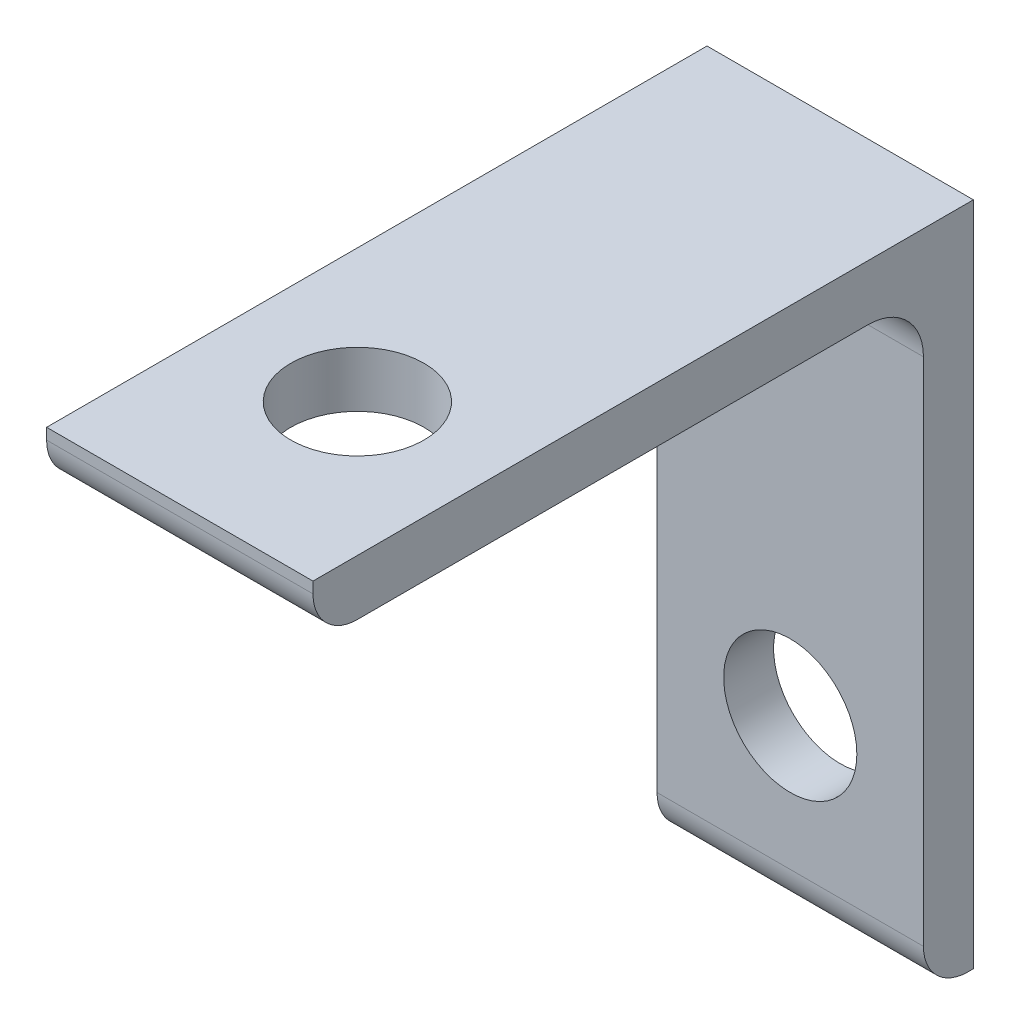
ISO-10303-21;
HEADER;
FILE_DESCRIPTION(('STEP AP214'),'2;1');
FILE_NAME('part.step','',(''),(''),'','','');
FILE_SCHEMA(('AUTOMOTIVE_DESIGN { 1 0 10303 214 1 1 1 1 }'));
ENDSEC;
DATA;
#1=APPLICATION_CONTEXT('core data for automotive mechanical design processes');
#2=APPLICATION_PROTOCOL_DEFINITION('international standard','automotive_design',2000,#1);
#3=PRODUCT_CONTEXT('',#1,'mechanical');
#4=PRODUCT('Part','Part','',(#3));
#5=PRODUCT_RELATED_PRODUCT_CATEGORY('part','',(#4));
#6=PRODUCT_DEFINITION_FORMATION('','',#4);
#7=PRODUCT_DEFINITION_CONTEXT('part definition',#1,'design');
#8=PRODUCT_DEFINITION('design','',#6,#7);
#9=PRODUCT_DEFINITION_SHAPE('','',#8);
#10=(LENGTH_UNIT() NAMED_UNIT(*) SI_UNIT(.MILLI.,.METRE.));
#11=(NAMED_UNIT(*) PLANE_ANGLE_UNIT() SI_UNIT($,.RADIAN.));
#12=(NAMED_UNIT(*) SI_UNIT($,.STERADIAN.) SOLID_ANGLE_UNIT());
#13=UNCERTAINTY_MEASURE_WITH_UNIT(LENGTH_MEASURE(1.E-05),#10,'distance_accuracy_value','');
#14=(GEOMETRIC_REPRESENTATION_CONTEXT(3) GLOBAL_UNCERTAINTY_ASSIGNED_CONTEXT((#13)) GLOBAL_UNIT_ASSIGNED_CONTEXT((#10,
#11,#12)) REPRESENTATION_CONTEXT('',''));
#15=CARTESIAN_POINT('',(0.,0.,0.));
#16=DIRECTION('',(0.,0.,1.));
#17=DIRECTION('',(1.,0.,0.));
#18=AXIS2_PLACEMENT_3D('',#15,#16,#17);
#19=CARTESIAN_POINT('',(0.,0.,0.225));
#20=DIRECTION('',(0.,0.,1.));
#21=DIRECTION('',(1.,0.,0.));
#22=AXIS2_PLACEMENT_3D('',#19,#20,#21);
#23=PLANE('',#22);
#24=CARTESIAN_POINT('',(-16.9035020845769,-5.65329655465321,0.225));
#25=DIRECTION('',(0.,0.,1.));
#26=DIRECTION('',(1.,0.,0.));
#27=AXIS2_PLACEMENT_3D('',#24,#25,#26);
#28=CIRCLE('',#27,0.3);
#29=CARTESIAN_POINT('',(-16.6035020845769,-5.65329655465321,0.225));
#30=VERTEX_POINT('',#29);
#31=EDGE_CURVE('E164',#30,#30,#28,.T.);
#32=ORIENTED_EDGE('',*,*,#31,.F.);
#33=EDGE_LOOP('',(#32));
#34=FACE_BOUND('',#33,.T.);
#35=DIRECTION('',(0.,-1.,0.));
#36=VECTOR('',#35,1.);
#37=CARTESIAN_POINT('',(-17.5035020845769,-3.45329655465321,0.225));
#38=LINE('',#37,#36);
#39=CARTESIAN_POINT('',(-17.5035020845769,-3.95329655465321,0.225));
#40=VERTEX_POINT('',#39);
#41=CARTESIAN_POINT('',(-17.5035020845769,-6.25329655465321,0.225));
#42=VERTEX_POINT('',#41);
#43=EDGE_CURVE('E141',#40,#42,#38,.T.);
#44=ORIENTED_EDGE('',*,*,#43,.T.);
#45=DIRECTION('',(-1.,0.,0.));
#46=VECTOR('',#45,1.);
#47=CARTESIAN_POINT('',(-16.3035020845769,-6.25329655465321,0.225));
#48=LINE('',#47,#46);
#49=CARTESIAN_POINT('',(-16.3035020845769,-6.25329655465321,0.225));
#50=VERTEX_POINT('',#49);
#51=EDGE_CURVE('E180',#50,#42,#48,.T.);
#52=ORIENTED_EDGE('',*,*,#51,.F.);
#53=DIRECTION('',(0.,1.,0.));
#54=VECTOR('',#53,1.);
#55=CARTESIAN_POINT('',(-16.3035020845769,-3.45329655465321,0.225));
#56=LINE('',#55,#54);
#57=CARTESIAN_POINT('',(-16.3035020845769,-3.95329655465321,0.225));
#58=VERTEX_POINT('',#57);
#59=EDGE_CURVE('E144',#50,#58,#56,.T.);
#60=ORIENTED_EDGE('',*,*,#59,.T.);
#61=DIRECTION('',(-1.,0.,0.));
#62=VECTOR('',#61,1.);
#63=CARTESIAN_POINT('',(-16.3035020845769,-3.95329655465321,0.225));
#64=LINE('',#63,#62);
#65=EDGE_CURVE('E136',#58,#40,#64,.T.);
#66=ORIENTED_EDGE('',*,*,#65,.T.);
#67=EDGE_LOOP('',(#44,#52,#60,#66));
#68=FACE_BOUND('',#67,.T.);
#69=ADVANCED_FACE('F34',(#34,#68),#23,.T.);
#70=CARTESIAN_POINT('',(-17.5035020845769,-3.45329655465321,0.225));
#71=DIRECTION('',(1.,0.,0.));
#72=DIRECTION('',(0.,0.,-1.));
#73=AXIS2_PLACEMENT_3D('',#70,#71,#72);
#74=PLANE('',#73);
#75=CARTESIAN_POINT('',(-17.5035020845769,-3.50329655465321,2.775));
#76=DIRECTION('',(-1.,0.,0.));
#77=DIRECTION('',(0.,0.,1.));
#78=AXIS2_PLACEMENT_3D('',#75,#76,#77);
#79=CIRCLE('',#78,0.2);
#80=CARTESIAN_POINT('',(-17.5035020845769,-3.70329655465321,2.775));
#81=VERTEX_POINT('',#80);
#82=CARTESIAN_POINT('',(-17.5035020845769,-3.50329655465321,2.975));
#83=VERTEX_POINT('',#82);
#84=EDGE_CURVE('E59',#81,#83,#79,.T.);
#85=ORIENTED_EDGE('',*,*,#84,.T.);
#86=DIRECTION('',(0.,1.,0.));
#87=VECTOR('',#86,1.);
#88=CARTESIAN_POINT('',(-17.5035020845769,-3.45329655465321,2.975));
#89=LINE('',#88,#87);
#90=CARTESIAN_POINT('',(-17.5035020845769,-3.45329655465321,2.975));
#91=VERTEX_POINT('',#90);
#92=EDGE_CURVE('E127',#83,#91,#89,.T.);
#93=ORIENTED_EDGE('',*,*,#92,.T.);
#94=DIRECTION('',(0.,0.,-1.));
#95=VECTOR('',#94,1.);
#96=CARTESIAN_POINT('',(-17.5035020845769,-3.45329655465321,0.225));
#97=LINE('',#96,#95);
#98=CARTESIAN_POINT('',(-17.5035020845769,-3.45329655465321,0.));
#99=VERTEX_POINT('',#98);
#100=EDGE_CURVE('E147',#91,#99,#97,.T.);
#101=ORIENTED_EDGE('',*,*,#100,.T.);
#102=DIRECTION('',(0.,-1.,0.));
#103=VECTOR('',#102,1.);
#104=CARTESIAN_POINT('',(-17.5035020845769,-3.45329655465321,0.));
#105=LINE('',#104,#103);
#106=CARTESIAN_POINT('',(-17.5035020845769,-6.45329655465321,0.));
#107=VERTEX_POINT('',#106);
#108=EDGE_CURVE('E140',#99,#107,#105,.T.);
#109=ORIENTED_EDGE('',*,*,#108,.T.);
#110=DIRECTION('',(0.,0.,-1.));
#111=VECTOR('',#110,1.);
#112=CARTESIAN_POINT('',(-17.5035020845769,-6.45329655465321,0.225));
#113=LINE('',#112,#111);
#114=CARTESIAN_POINT('',(-17.5035020845769,-6.45329655465321,0.025));
#115=VERTEX_POINT('',#114);
#116=EDGE_CURVE('E11',#115,#107,#113,.T.);
#117=ORIENTED_EDGE('',*,*,#116,.F.);
#118=CARTESIAN_POINT('',(-17.5035020845769,-6.25329655465321,0.025));
#119=DIRECTION('',(-1.,0.,0.));
#120=DIRECTION('',(0.,0.,1.));
#121=AXIS2_PLACEMENT_3D('',#118,#119,#120);
#122=CIRCLE('',#121,0.2);
#123=EDGE_CURVE('E163',#42,#115,#122,.F.);
#124=ORIENTED_EDGE('',*,*,#123,.F.);
#125=ORIENTED_EDGE('',*,*,#43,.F.);
#126=CARTESIAN_POINT('',(-17.5035020845769,-3.95329655465321,0.475));
#127=DIRECTION('',(-1.,0.,0.));
#128=DIRECTION('',(0.,0.,1.));
#129=AXIS2_PLACEMENT_3D('',#126,#127,#128);
#130=CIRCLE('',#129,0.25);
#131=CARTESIAN_POINT('',(-17.5035020845769,-3.70329655465321,0.475000000000002));
#132=VERTEX_POINT('',#131);
#133=EDGE_CURVE('E178',#132,#40,#130,.T.);
#134=ORIENTED_EDGE('',*,*,#133,.F.);
#135=DIRECTION('',(0.,0.,1.));
#136=VECTOR('',#135,1.);
#137=CARTESIAN_POINT('',(-17.5035020845769,-3.70329655465321,0.225));
#138=LINE('',#137,#136);
#139=EDGE_CURVE('E131',#132,#81,#138,.T.);
#140=ORIENTED_EDGE('',*,*,#139,.T.);
#141=EDGE_LOOP('',(#85,#93,#101,#109,#117,#124,#125,#134,#140));
#142=FACE_BOUND('',#141,.T.);
#143=ADVANCED_FACE('F36',(#142),#74,.F.);
#144=CARTESIAN_POINT('',(-17.5035020845769,-6.45329655465321,0.225));
#145=DIRECTION('',(0.,1.,0.));
#146=DIRECTION('',(0.,0.,1.));
#147=AXIS2_PLACEMENT_3D('',#144,#145,#146);
#148=PLANE('',#147);
#149=DIRECTION('',(-1.,0.,0.));
#150=VECTOR('',#149,1.);
#151=CARTESIAN_POINT('',(-16.3035020845769,-6.45329655465321,0.025));
#152=LINE('',#151,#150);
#153=CARTESIAN_POINT('',(-16.3035020845769,-6.45329655465321,0.025));
#154=VERTEX_POINT('',#153);
#155=EDGE_CURVE('E51',#154,#115,#152,.T.);
#156=ORIENTED_EDGE('',*,*,#155,.T.);
#157=ORIENTED_EDGE('',*,*,#116,.T.);
#158=DIRECTION('',(1.,0.,0.));
#159=VECTOR('',#158,1.);
#160=CARTESIAN_POINT('',(-17.5035020845769,-6.45329655465321,0.));
#161=LINE('',#160,#159);
#162=CARTESIAN_POINT('',(-16.3035020845769,-6.45329655465321,0.));
#163=VERTEX_POINT('',#162);
#164=EDGE_CURVE('E150',#107,#163,#161,.T.);
#165=ORIENTED_EDGE('',*,*,#164,.T.);
#166=DIRECTION('',(0.,0.,-1.));
#167=VECTOR('',#166,1.);
#168=CARTESIAN_POINT('',(-16.3035020845769,-6.45329655465321,0.225));
#169=LINE('',#168,#167);
#170=EDGE_CURVE('E43',#154,#163,#169,.T.);
#171=ORIENTED_EDGE('',*,*,#170,.F.);
#172=EDGE_LOOP('',(#156,#157,#165,#171));
#173=FACE_BOUND('',#172,.T.);
#174=ADVANCED_FACE('F200',(#173),#148,.F.);
#175=CARTESIAN_POINT('',(-16.3035020845769,-3.45329655465321,0.225));
#176=DIRECTION('',(-1.,0.,0.));
#177=DIRECTION('',(0.,0.,1.));
#178=AXIS2_PLACEMENT_3D('',#175,#176,#177);
#179=PLANE('',#178);
#180=CARTESIAN_POINT('',(-16.3035020845769,-3.50329655465321,2.775));
#181=DIRECTION('',(-1.,0.,0.));
#182=DIRECTION('',(0.,0.,1.));
#183=AXIS2_PLACEMENT_3D('',#180,#181,#182);
#184=CIRCLE('',#183,0.2);
#185=CARTESIAN_POINT('',(-16.3035020845769,-3.70329655465321,2.775));
#186=VERTEX_POINT('',#185);
#187=CARTESIAN_POINT('',(-16.3035020845769,-3.50329655465321,2.975));
#188=VERTEX_POINT('',#187);
#189=EDGE_CURVE('E106',#186,#188,#184,.T.);
#190=ORIENTED_EDGE('',*,*,#189,.F.);
#191=DIRECTION('',(0.,0.,1.));
#192=VECTOR('',#191,1.);
#193=CARTESIAN_POINT('',(-16.3035020845769,-3.70329655465321,0.225));
#194=LINE('',#193,#192);
#195=CARTESIAN_POINT('',(-16.3035020845769,-3.70329655465321,0.475000000000002));
#196=VERTEX_POINT('',#195);
#197=EDGE_CURVE('E119',#196,#186,#194,.T.);
#198=ORIENTED_EDGE('',*,*,#197,.F.);
#199=CARTESIAN_POINT('',(-16.3035020845769,-3.95329655465321,0.475));
#200=DIRECTION('',(-1.,0.,0.));
#201=DIRECTION('',(0.,0.,1.));
#202=AXIS2_PLACEMENT_3D('',#199,#200,#201);
#203=CIRCLE('',#202,0.25);
#204=EDGE_CURVE('E184',#196,#58,#203,.T.);
#205=ORIENTED_EDGE('',*,*,#204,.T.);
#206=ORIENTED_EDGE('',*,*,#59,.F.);
#207=CARTESIAN_POINT('',(-16.3035020845769,-6.25329655465321,0.025));
#208=DIRECTION('',(-1.,0.,0.));
#209=DIRECTION('',(0.,0.,1.));
#210=AXIS2_PLACEMENT_3D('',#207,#208,#209);
#211=CIRCLE('',#210,0.2);
#212=EDGE_CURVE('E167',#50,#154,#211,.F.);
#213=ORIENTED_EDGE('',*,*,#212,.T.);
#214=ORIENTED_EDGE('',*,*,#170,.T.);
#215=DIRECTION('',(0.,1.,0.));
#216=VECTOR('',#215,1.);
#217=CARTESIAN_POINT('',(-16.3035020845769,-3.45329655465321,0.));
#218=LINE('',#217,#216);
#219=CARTESIAN_POINT('',(-16.3035020845769,-3.45329655465321,0.));
#220=VERTEX_POINT('',#219);
#221=EDGE_CURVE('E153',#163,#220,#218,.T.);
#222=ORIENTED_EDGE('',*,*,#221,.T.);
#223=DIRECTION('',(0.,0.,-1.));
#224=VECTOR('',#223,1.);
#225=CARTESIAN_POINT('',(-16.3035020845769,-3.45329655465321,0.225));
#226=LINE('',#225,#224);
#227=CARTESIAN_POINT('',(-16.3035020845769,-3.45329655465321,2.975));
#228=VERTEX_POINT('',#227);
#229=EDGE_CURVE('E158',#228,#220,#226,.T.);
#230=ORIENTED_EDGE('',*,*,#229,.F.);
#231=DIRECTION('',(0.,1.,0.));
#232=VECTOR('',#231,1.);
#233=CARTESIAN_POINT('',(-16.3035020845769,-3.45329655465321,2.975));
#234=LINE('',#233,#232);
#235=EDGE_CURVE('E121',#188,#228,#234,.T.);
#236=ORIENTED_EDGE('',*,*,#235,.F.);
#237=EDGE_LOOP('',(#190,#198,#205,#206,#213,#214,#222,#230,#236));
#238=FACE_BOUND('',#237,.T.);
#239=ADVANCED_FACE('F117',(#238),#179,.F.);
#240=CARTESIAN_POINT('',(-16.3035020845769,-3.70329655465321,0.225));
#241=DIRECTION('',(0.,-1.,0.));
#242=DIRECTION('',(0.,0.,-1.));
#243=AXIS2_PLACEMENT_3D('',#240,#241,#242);
#244=PLANE('',#243);
#245=CARTESIAN_POINT('',(-16.9035020845769,-3.70329655465321,2.17499999999999));
#246=DIRECTION('',(0.,-1.,0.));
#247=DIRECTION('',(0.,0.,-1.));
#248=AXIS2_PLACEMENT_3D('',#245,#246,#247);
#249=CIRCLE('',#248,0.3);
#250=CARTESIAN_POINT('',(-16.9035020845769,-3.70329655465321,1.87499999999999));
#251=VERTEX_POINT('',#250);
#252=EDGE_CURVE('E174',#251,#251,#249,.T.);
#253=ORIENTED_EDGE('',*,*,#252,.F.);
#254=EDGE_LOOP('',(#253));
#255=FACE_BOUND('',#254,.T.);
#256=ORIENTED_EDGE('',*,*,#197,.T.);
#257=DIRECTION('',(-1.,0.,0.));
#258=VECTOR('',#257,1.);
#259=CARTESIAN_POINT('',(-16.3035020845769,-3.70329655465321,2.775));
#260=LINE('',#259,#258);
#261=EDGE_CURVE('E103',#186,#81,#260,.T.);
#262=ORIENTED_EDGE('',*,*,#261,.T.);
#263=ORIENTED_EDGE('',*,*,#139,.F.);
#264=DIRECTION('',(-1.,0.,0.));
#265=VECTOR('',#264,1.);
#266=CARTESIAN_POINT('',(-16.3035020845769,-3.70329655465321,0.475000000000002));
#267=LINE('',#266,#265);
#268=EDGE_CURVE('E126',#196,#132,#267,.T.);
#269=ORIENTED_EDGE('',*,*,#268,.F.);
#270=EDGE_LOOP('',(#256,#262,#263,#269));
#271=FACE_BOUND('',#270,.T.);
#272=ADVANCED_FACE('F124',(#255,#271),#244,.T.);
#273=CARTESIAN_POINT('',(-17.5035020845769,-3.45329655465321,0.225));
#274=DIRECTION('',(0.,-1.,0.));
#275=DIRECTION('',(0.,0.,-1.));
#276=AXIS2_PLACEMENT_3D('',#273,#274,#275);
#277=PLANE('',#276);
#278=CARTESIAN_POINT('',(-16.9035020845769,-3.45329655465321,2.17499999999999));
#279=DIRECTION('',(0.,-1.,0.));
#280=DIRECTION('',(0.,0.,-1.));
#281=AXIS2_PLACEMENT_3D('',#278,#279,#280);
#282=CIRCLE('',#281,0.3);
#283=CARTESIAN_POINT('',(-16.9035020845769,-3.45329655465321,1.87499999999999));
#284=VERTEX_POINT('',#283);
#285=EDGE_CURVE('E38',#284,#284,#282,.T.);
#286=ORIENTED_EDGE('',*,*,#285,.T.);
#287=EDGE_LOOP('',(#286));
#288=FACE_BOUND('',#287,.T.);
#289=DIRECTION('',(-1.,0.,0.));
#290=VECTOR('',#289,1.);
#291=CARTESIAN_POINT('',(-17.5035020845769,-3.45329655465321,0.));
#292=LINE('',#291,#290);
#293=EDGE_CURVE('E145',#220,#99,#292,.T.);
#294=ORIENTED_EDGE('',*,*,#293,.T.);
#295=ORIENTED_EDGE('',*,*,#100,.F.);
#296=DIRECTION('',(-1.,0.,0.));
#297=VECTOR('',#296,1.);
#298=CARTESIAN_POINT('',(-16.3035020845769,-3.45329655465321,2.975));
#299=LINE('',#298,#297);
#300=EDGE_CURVE('E129',#228,#91,#299,.T.);
#301=ORIENTED_EDGE('',*,*,#300,.F.);
#302=ORIENTED_EDGE('',*,*,#229,.T.);
#303=EDGE_LOOP('',(#294,#295,#301,#302));
#304=FACE_BOUND('',#303,.T.);
#305=ADVANCED_FACE('F209',(#288,#304),#277,.F.);
#306=CARTESIAN_POINT('',(0.,0.,0.));
#307=DIRECTION('',(0.,0.,1.));
#308=DIRECTION('',(1.,0.,0.));
#309=AXIS2_PLACEMENT_3D('',#306,#307,#308);
#310=PLANE('',#309);
#311=CARTESIAN_POINT('',(-16.9035020845769,-5.65329655465321,0.));
#312=DIRECTION('',(0.,0.,1.));
#313=DIRECTION('',(1.,0.,0.));
#314=AXIS2_PLACEMENT_3D('',#311,#312,#313);
#315=CIRCLE('',#314,0.3);
#316=CARTESIAN_POINT('',(-16.6035020845769,-5.65329655465321,0.));
#317=VERTEX_POINT('',#316);
#318=EDGE_CURVE('E161',#317,#317,#315,.T.);
#319=ORIENTED_EDGE('',*,*,#318,.T.);
#320=EDGE_LOOP('',(#319));
#321=FACE_BOUND('',#320,.T.);
#322=ORIENTED_EDGE('',*,*,#108,.F.);
#323=ORIENTED_EDGE('',*,*,#293,.F.);
#324=ORIENTED_EDGE('',*,*,#221,.F.);
#325=ORIENTED_EDGE('',*,*,#164,.F.);
#326=EDGE_LOOP('',(#322,#323,#324,#325));
#327=FACE_BOUND('',#326,.T.);
#328=ADVANCED_FACE('F206',(#321,#327),#310,.F.);
#329=CARTESIAN_POINT('',(-16.3035020845769,-3.45329655465321,2.975));
#330=DIRECTION('',(0.,0.,1.));
#331=DIRECTION('',(1.,0.,0.));
#332=AXIS2_PLACEMENT_3D('',#329,#330,#331);
#333=PLANE('',#332);
#334=DIRECTION('',(-1.,0.,0.));
#335=VECTOR('',#334,1.);
#336=CARTESIAN_POINT('',(-16.3035020845769,-3.50329655465321,2.975));
#337=LINE('',#336,#335);
#338=EDGE_CURVE('E112',#188,#83,#337,.T.);
#339=ORIENTED_EDGE('',*,*,#338,.F.);
#340=ORIENTED_EDGE('',*,*,#235,.T.);
#341=ORIENTED_EDGE('',*,*,#300,.T.);
#342=ORIENTED_EDGE('',*,*,#92,.F.);
#343=EDGE_LOOP('',(#339,#340,#341,#342));
#344=FACE_BOUND('',#343,.T.);
#345=ADVANCED_FACE('F212',(#344),#333,.T.);
#346=CARTESIAN_POINT('',(-16.3035020845769,-3.95329655465321,0.475));
#347=DIRECTION('',(-1.,0.,0.));
#348=DIRECTION('',(0.,0.,1.));
#349=AXIS2_PLACEMENT_3D('',#346,#347,#348);
#350=CYLINDRICAL_SURFACE('',#349,0.25);
#351=ORIENTED_EDGE('',*,*,#133,.T.);
#352=ORIENTED_EDGE('',*,*,#65,.F.);
#353=ORIENTED_EDGE('',*,*,#204,.F.);
#354=ORIENTED_EDGE('',*,*,#268,.T.);
#355=EDGE_LOOP('',(#351,#352,#353,#354));
#356=FACE_BOUND('',#355,.T.);
#357=ADVANCED_FACE('F191',(#356),#350,.F.);
#358=CARTESIAN_POINT('',(-16.3035020845769,-3.50329655465321,2.775));
#359=DIRECTION('',(-1.,0.,0.));
#360=DIRECTION('',(0.,0.,1.));
#361=AXIS2_PLACEMENT_3D('',#358,#359,#360);
#362=CYLINDRICAL_SURFACE('',#361,0.2);
#363=ORIENTED_EDGE('',*,*,#84,.F.);
#364=ORIENTED_EDGE('',*,*,#261,.F.);
#365=ORIENTED_EDGE('',*,*,#189,.T.);
#366=ORIENTED_EDGE('',*,*,#338,.T.);
#367=EDGE_LOOP('',(#363,#364,#365,#366));
#368=FACE_BOUND('',#367,.T.);
#369=ADVANCED_FACE('F105',(#368),#362,.T.);
#370=CARTESIAN_POINT('',(-16.3035020845769,-6.25329655465321,0.025));
#371=DIRECTION('',(-1.,0.,0.));
#372=DIRECTION('',(0.,0.,1.));
#373=AXIS2_PLACEMENT_3D('',#370,#371,#372);
#374=CYLINDRICAL_SURFACE('',#373,0.2);
#375=ORIENTED_EDGE('',*,*,#123,.T.);
#376=ORIENTED_EDGE('',*,*,#155,.F.);
#377=ORIENTED_EDGE('',*,*,#212,.F.);
#378=ORIENTED_EDGE('',*,*,#51,.T.);
#379=EDGE_LOOP('',(#375,#376,#377,#378));
#380=FACE_BOUND('',#379,.T.);
#381=ADVANCED_FACE('F271',(#380),#374,.T.);
#382=CARTESIAN_POINT('',(-16.9035020845769,-5.65329655465321,-0.975));
#383=DIRECTION('',(0.,0.,1.));
#384=DIRECTION('',(1.,0.,0.));
#385=AXIS2_PLACEMENT_3D('',#382,#383,#384);
#386=CYLINDRICAL_SURFACE('',#385,0.3);
#387=ORIENTED_EDGE('',*,*,#31,.T.);
#388=EDGE_LOOP('',(#387));
#389=FACE_BOUND('',#388,.T.);
#390=ORIENTED_EDGE('',*,*,#318,.F.);
#391=EDGE_LOOP('',(#390));
#392=FACE_BOUND('',#391,.T.);
#393=ADVANCED_FACE('F266',(#389,#392),#386,.F.);
#394=CARTESIAN_POINT('',(-16.9035020845769,-2.50329655465321,2.17499999999999));
#395=DIRECTION('',(0.,-1.,0.));
#396=DIRECTION('',(0.,0.,-1.));
#397=AXIS2_PLACEMENT_3D('',#394,#395,#396);
#398=CYLINDRICAL_SURFACE('',#397,0.3);
#399=ORIENTED_EDGE('',*,*,#252,.T.);
#400=EDGE_LOOP('',(#399));
#401=FACE_BOUND('',#400,.T.);
#402=ORIENTED_EDGE('',*,*,#285,.F.);
#403=EDGE_LOOP('',(#402));
#404=FACE_BOUND('',#403,.T.);
#405=ADVANCED_FACE('F270',(#401,#404),#398,.F.);
#406=CLOSED_SHELL('',(#69,#143,#174,#239,#272,#305,#328,#345,#357,#369,#381,#393,#405));
#407=MANIFOLD_SOLID_BREP('B2',#406);
#408=ADVANCED_BREP_SHAPE_REPRESENTATION('',(#18,#407),#14);
#409=SHAPE_DEFINITION_REPRESENTATION(#9,#408);
ENDSEC;
END-ISO-10303-21;
